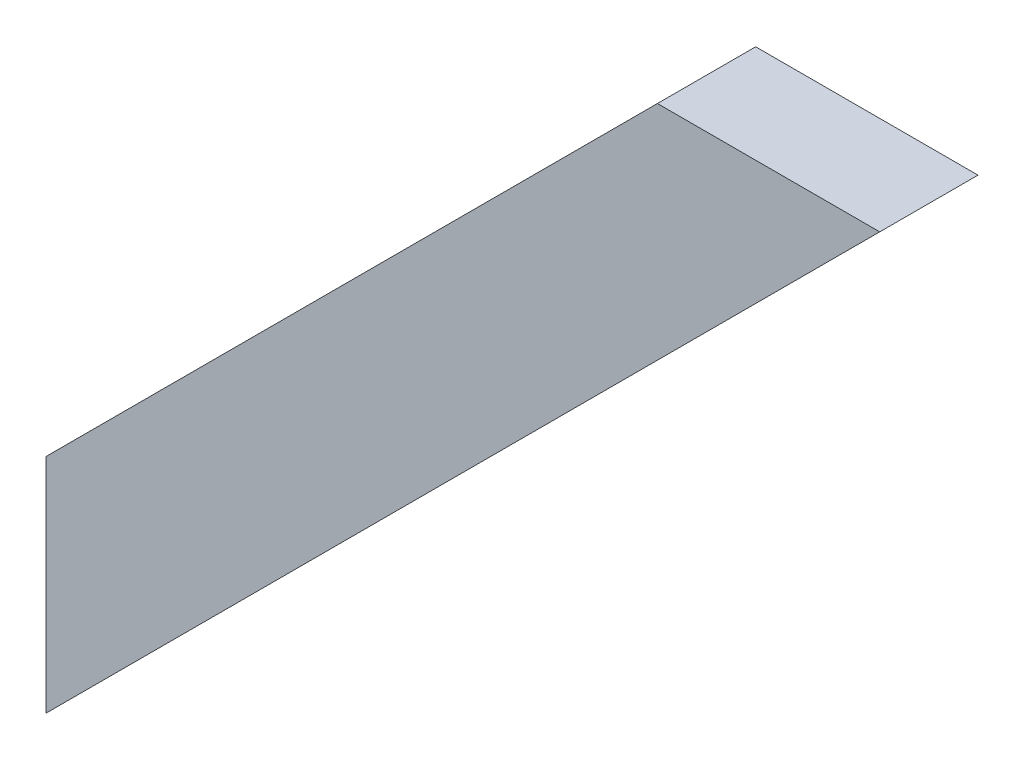
ISO-10303-21;
HEADER;
FILE_DESCRIPTION(('STEP AP214'),'2;1');
FILE_NAME('part.step','',(''),(''),'','','');
FILE_SCHEMA(('AUTOMOTIVE_DESIGN { 1 0 10303 214 1 1 1 1 }'));
ENDSEC;
DATA;
#1=APPLICATION_CONTEXT('core data for automotive mechanical design processes');
#2=APPLICATION_PROTOCOL_DEFINITION('international standard','automotive_design',2000,#1);
#3=PRODUCT_CONTEXT('',#1,'mechanical');
#4=PRODUCT('Part','Part','',(#3));
#5=PRODUCT_RELATED_PRODUCT_CATEGORY('part','',(#4));
#6=PRODUCT_DEFINITION_FORMATION('','',#4);
#7=PRODUCT_DEFINITION_CONTEXT('part definition',#1,'design');
#8=PRODUCT_DEFINITION('design','',#6,#7);
#9=PRODUCT_DEFINITION_SHAPE('','',#8);
#10=(LENGTH_UNIT() NAMED_UNIT(*) SI_UNIT(.MILLI.,.METRE.));
#11=(NAMED_UNIT(*) PLANE_ANGLE_UNIT() SI_UNIT($,.RADIAN.));
#12=(NAMED_UNIT(*) SI_UNIT($,.STERADIAN.) SOLID_ANGLE_UNIT());
#13=UNCERTAINTY_MEASURE_WITH_UNIT(LENGTH_MEASURE(1.E-05),#10,'distance_accuracy_value','');
#14=(GEOMETRIC_REPRESENTATION_CONTEXT(3) GLOBAL_UNCERTAINTY_ASSIGNED_CONTEXT((#13)) GLOBAL_UNIT_ASSIGNED_CONTEXT((#10,
#11,#12)) REPRESENTATION_CONTEXT('',''));
#15=CARTESIAN_POINT('',(0.,0.,0.));
#16=DIRECTION('',(0.,0.,1.));
#17=DIRECTION('',(1.,0.,0.));
#18=AXIS2_PLACEMENT_3D('',#15,#16,#17);
#19=CARTESIAN_POINT('',(0.,56.5685424949241,25.));
#20=DIRECTION('',(1.,0.,0.));
#21=DIRECTION('',(0.,1.,0.));
#22=AXIS2_PLACEMENT_3D('',#19,#20,#21);
#23=PLANE('',#22);
#24=DIRECTION('',(0.,-1.,0.));
#25=VECTOR('',#24,1.);
#26=CARTESIAN_POINT('',(0.,56.5685424949241,0.));
#27=LINE('',#26,#25);
#28=CARTESIAN_POINT('',(0.,56.5685424949241,0.));
#29=VERTEX_POINT('',#28);
#30=CARTESIAN_POINT('',(0.,0.,0.));
#31=VERTEX_POINT('',#30);
#32=EDGE_CURVE('E95',#29,#31,#27,.T.);
#33=ORIENTED_EDGE('',*,*,#32,.T.);
#34=DIRECTION('',(0.,0.,-1.));
#35=VECTOR('',#34,1.);
#36=CARTESIAN_POINT('',(0.,0.,25.));
#37=LINE('',#36,#35);
#38=CARTESIAN_POINT('',(0.,0.,25.));
#39=VERTEX_POINT('',#38);
#40=EDGE_CURVE('E11',#39,#31,#37,.T.);
#41=ORIENTED_EDGE('',*,*,#40,.F.);
#42=DIRECTION('',(0.,-1.,0.));
#43=VECTOR('',#42,1.);
#44=CARTESIAN_POINT('',(0.,56.5685424949241,25.));
#45=LINE('',#44,#43);
#46=CARTESIAN_POINT('',(0.,56.5685424949241,25.));
#47=VERTEX_POINT('',#46);
#48=EDGE_CURVE('E83',#47,#39,#45,.T.);
#49=ORIENTED_EDGE('',*,*,#48,.F.);
#50=DIRECTION('',(0.,0.,-1.));
#51=VECTOR('',#50,1.);
#52=CARTESIAN_POINT('',(0.,56.5685424949241,25.));
#53=LINE('',#52,#51);
#54=EDGE_CURVE('E91',#47,#29,#53,.T.);
#55=ORIENTED_EDGE('',*,*,#54,.T.);
#56=EDGE_LOOP('',(#33,#41,#49,#55));
#57=FACE_BOUND('',#56,.T.);
#58=ADVANCED_FACE('F32',(#57),#23,.F.);
#59=CARTESIAN_POINT('',(0.,0.,25.));
#60=DIRECTION('',(-0.707106781186552,0.707106781186544,0.));
#61=DIRECTION('',(-0.707106781186544,-0.707106781186551,0.));
#62=AXIS2_PLACEMENT_3D('',#59,#60,#61);
#63=PLANE('',#62);
#64=DIRECTION('',(0.707106781186544,0.707106781186552,0.));
#65=VECTOR('',#64,1.);
#66=CARTESIAN_POINT('',(0.,0.,0.));
#67=LINE('',#66,#65);
#68=CARTESIAN_POINT('',(212.132034355963,212.132034355965,0.));
#69=VERTEX_POINT('',#68);
#70=EDGE_CURVE('E87',#31,#69,#67,.T.);
#71=ORIENTED_EDGE('',*,*,#70,.T.);
#72=DIRECTION('',(0.,0.,-1.));
#73=VECTOR('',#72,1.);
#74=CARTESIAN_POINT('',(212.132034355963,212.132034355965,25.));
#75=LINE('',#74,#73);
#76=CARTESIAN_POINT('',(212.132034355963,212.132034355965,25.));
#77=VERTEX_POINT('',#76);
#78=EDGE_CURVE('E40',#77,#69,#75,.T.);
#79=ORIENTED_EDGE('',*,*,#78,.F.);
#80=DIRECTION('',(0.707106781186544,0.707106781186552,0.));
#81=VECTOR('',#80,1.);
#82=CARTESIAN_POINT('',(0.,0.,25.));
#83=LINE('',#82,#81);
#84=EDGE_CURVE('E78',#39,#77,#83,.T.);
#85=ORIENTED_EDGE('',*,*,#84,.F.);
#86=ORIENTED_EDGE('',*,*,#40,.T.);
#87=EDGE_LOOP('',(#71,#79,#85,#86));
#88=FACE_BOUND('',#87,.T.);
#89=ADVANCED_FACE('F86',(#88),#63,.F.);
#90=CARTESIAN_POINT('',(212.132034355963,212.132034355965,25.));
#91=DIRECTION('',(0.,-1.,0.));
#92=DIRECTION('',(0.,0.,-1.));
#93=AXIS2_PLACEMENT_3D('',#90,#91,#92);
#94=PLANE('',#93);
#95=DIRECTION('',(-1.,0.,0.));
#96=VECTOR('',#95,1.);
#97=CARTESIAN_POINT('',(212.132034355963,212.132034355965,0.));
#98=LINE('',#97,#96);
#99=CARTESIAN_POINT('',(155.56349186104,212.132034355965,0.));
#100=VERTEX_POINT('',#99);
#101=EDGE_CURVE('E65',#69,#100,#98,.T.);
#102=ORIENTED_EDGE('',*,*,#101,.T.);
#103=DIRECTION('',(0.,0.,-1.));
#104=VECTOR('',#103,1.);
#105=CARTESIAN_POINT('',(155.56349186104,212.132034355965,25.));
#106=LINE('',#105,#104);
#107=CARTESIAN_POINT('',(155.56349186104,212.132034355965,25.));
#108=VERTEX_POINT('',#107);
#109=EDGE_CURVE('E88',#108,#100,#106,.T.);
#110=ORIENTED_EDGE('',*,*,#109,.F.);
#111=DIRECTION('',(-1.,0.,0.));
#112=VECTOR('',#111,1.);
#113=CARTESIAN_POINT('',(212.132034355963,212.132034355965,25.));
#114=LINE('',#113,#112);
#115=EDGE_CURVE('E81',#77,#108,#114,.T.);
#116=ORIENTED_EDGE('',*,*,#115,.F.);
#117=ORIENTED_EDGE('',*,*,#78,.T.);
#118=EDGE_LOOP('',(#102,#110,#116,#117));
#119=FACE_BOUND('',#118,.T.);
#120=ADVANCED_FACE('F89',(#119),#94,.F.);
#121=CARTESIAN_POINT('',(155.56349186104,212.132034355965,25.));
#122=DIRECTION('',(0.707106781186552,-0.707106781186543,0.));
#123=DIRECTION('',(0.707106781186543,0.707106781186552,0.));
#124=AXIS2_PLACEMENT_3D('',#121,#122,#123);
#125=PLANE('',#124);
#126=DIRECTION('',(-0.707106781186543,-0.707106781186552,0.));
#127=VECTOR('',#126,1.);
#128=CARTESIAN_POINT('',(155.56349186104,212.132034355965,0.));
#129=LINE('',#128,#127);
#130=EDGE_CURVE('E71',#100,#29,#129,.T.);
#131=ORIENTED_EDGE('',*,*,#130,.T.);
#132=ORIENTED_EDGE('',*,*,#54,.F.);
#133=DIRECTION('',(-0.707106781186543,-0.707106781186552,0.));
#134=VECTOR('',#133,1.);
#135=CARTESIAN_POINT('',(155.56349186104,212.132034355965,25.));
#136=LINE('',#135,#134);
#137=EDGE_CURVE('E48',#108,#47,#136,.T.);
#138=ORIENTED_EDGE('',*,*,#137,.F.);
#139=ORIENTED_EDGE('',*,*,#109,.T.);
#140=EDGE_LOOP('',(#131,#132,#138,#139));
#141=FACE_BOUND('',#140,.T.);
#142=ADVANCED_FACE('F102',(#141),#125,.F.);
#143=CARTESIAN_POINT('',(0.,0.,25.));
#144=DIRECTION('',(0.,0.,-1.));
#145=DIRECTION('',(-1.,0.,0.));
#146=AXIS2_PLACEMENT_3D('',#143,#144,#145);
#147=PLANE('',#146);
#148=ORIENTED_EDGE('',*,*,#48,.T.);
#149=ORIENTED_EDGE('',*,*,#84,.T.);
#150=ORIENTED_EDGE('',*,*,#115,.T.);
#151=ORIENTED_EDGE('',*,*,#137,.T.);
#152=EDGE_LOOP('',(#148,#149,#150,#151));
#153=FACE_BOUND('',#152,.T.);
#154=ADVANCED_FACE('F79',(#153),#147,.F.);
#155=CARTESIAN_POINT('',(0.,0.,0.));
#156=DIRECTION('',(0.,0.,-1.));
#157=DIRECTION('',(-1.,0.,0.));
#158=AXIS2_PLACEMENT_3D('',#155,#156,#157);
#159=PLANE('',#158);
#160=ORIENTED_EDGE('',*,*,#32,.F.);
#161=ORIENTED_EDGE('',*,*,#130,.F.);
#162=ORIENTED_EDGE('',*,*,#101,.F.);
#163=ORIENTED_EDGE('',*,*,#70,.F.);
#164=EDGE_LOOP('',(#160,#161,#162,#163));
#165=FACE_BOUND('',#164,.T.);
#166=ADVANCED_FACE('F105',(#165),#159,.T.);
#167=CLOSED_SHELL('',(#58,#89,#120,#142,#154,#166));
#168=MANIFOLD_SOLID_BREP('B2',#167);
#169=ADVANCED_BREP_SHAPE_REPRESENTATION('',(#18,#168),#14);
#170=SHAPE_DEFINITION_REPRESENTATION(#9,#169);
ENDSEC;
END-ISO-10303-21;
